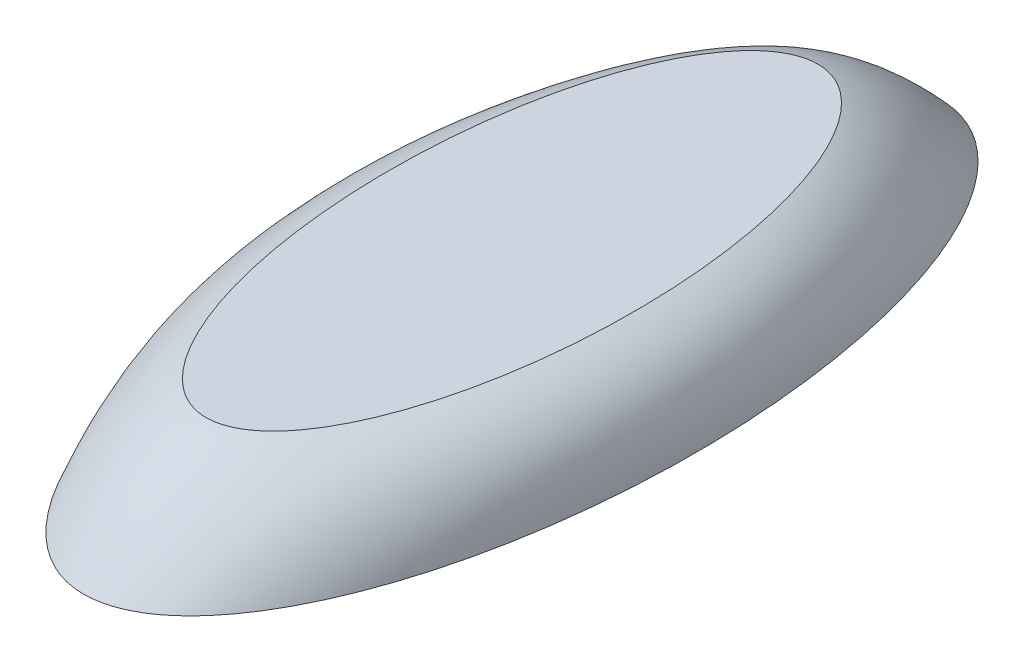
ISO-10303-21;
HEADER;
FILE_DESCRIPTION(('STEP AP214'),'2;1');
FILE_NAME('part.step','',(''),(''),'','','');
FILE_SCHEMA(('AUTOMOTIVE_DESIGN { 1 0 10303 214 1 1 1 1 }'));
ENDSEC;
DATA;
#1=APPLICATION_CONTEXT('core data for automotive mechanical design processes');
#2=APPLICATION_PROTOCOL_DEFINITION('international standard','automotive_design',2000,#1);
#3=PRODUCT_CONTEXT('',#1,'mechanical');
#4=PRODUCT('Part','Part','',(#3));
#5=PRODUCT_RELATED_PRODUCT_CATEGORY('part','',(#4));
#6=PRODUCT_DEFINITION_FORMATION('','',#4);
#7=PRODUCT_DEFINITION_CONTEXT('part definition',#1,'design');
#8=PRODUCT_DEFINITION('design','',#6,#7);
#9=PRODUCT_DEFINITION_SHAPE('','',#8);
#10=(LENGTH_UNIT() NAMED_UNIT(*) SI_UNIT(.MILLI.,.METRE.));
#11=(NAMED_UNIT(*) PLANE_ANGLE_UNIT() SI_UNIT($,.RADIAN.));
#12=(NAMED_UNIT(*) SI_UNIT($,.STERADIAN.) SOLID_ANGLE_UNIT());
#13=UNCERTAINTY_MEASURE_WITH_UNIT(LENGTH_MEASURE(1.E-05),#10,'distance_accuracy_value','');
#14=(GEOMETRIC_REPRESENTATION_CONTEXT(3) GLOBAL_UNCERTAINTY_ASSIGNED_CONTEXT((#13)) GLOBAL_UNIT_ASSIGNED_CONTEXT((#10,
#11,#12)) REPRESENTATION_CONTEXT('',''));
#15=CARTESIAN_POINT('',(0.,0.,0.));
#16=DIRECTION('',(0.,0.,1.));
#17=DIRECTION('',(1.,0.,0.));
#18=AXIS2_PLACEMENT_3D('',#15,#16,#17);
#19=CARTESIAN_POINT('',(0.,0.,0.));
#20=DIRECTION('',(0.,1.,0.));
#21=DIRECTION('',(0.,0.,1.));
#22=AXIS2_PLACEMENT_3D('',#19,#20,#21);
#23=PLANE('',#22);
#24=CARTESIAN_POINT('',(0.,0.,200.));
#25=DIRECTION('',(0.,1.,0.));
#26=DIRECTION('',(0.,0.,1.));
#27=AXIS2_PLACEMENT_3D('',#24,#25,#26);
#28=CIRCLE('',#27,20.);
#29=CARTESIAN_POINT('',(0.,0.,220.));
#30=VERTEX_POINT('',#29);
#31=EDGE_CURVE('E12',#30,#30,#28,.F.);
#32=ORIENTED_EDGE('',*,*,#31,.F.);
#33=EDGE_LOOP('',(#32));
#34=FACE_BOUND('',#33,.T.);
#35=CARTESIAN_POINT('',(0.,0.,0.));
#36=DIRECTION('',(0.,1.,0.));
#37=DIRECTION('',(0.,0.,-1.));
#38=AXIS2_PLACEMENT_3D('',#35,#36,#37);
#39=ELLIPSE('',#38,280.,120.);
#40=CARTESIAN_POINT('',(0.,0.,-280.));
#41=VERTEX_POINT('',#40);
#42=EDGE_CURVE('E95',#41,#41,#39,.T.);
#43=ORIENTED_EDGE('',*,*,#42,.F.);
#44=EDGE_LOOP('',(#43));
#45=FACE_BOUND('',#44,.T.);
#46=ADVANCED_FACE('F88',(#34,#45),#23,.F.);
#47=CARTESIAN_POINT('',(0.,60.,0.));
#48=DIRECTION('',(0.,1.,0.));
#49=DIRECTION('',(0.,0.,1.));
#50=AXIS2_PLACEMENT_3D('',#47,#48,#49);
#51=PLANE('',#50);
#52=CARTESIAN_POINT('',(0.,60.,0.));
#53=DIRECTION('',(0.,1.,0.));
#54=DIRECTION('',(0.,0.,-1.));
#55=AXIS2_PLACEMENT_3D('',#52,#53,#54);
#56=ELLIPSE('',#55,200.,80.);
#57=CARTESIAN_POINT('',(0.,60.,-200.));
#58=VERTEX_POINT('',#57);
#59=EDGE_CURVE('E99',#58,#58,#56,.T.);
#60=ORIENTED_EDGE('',*,*,#59,.T.);
#61=EDGE_LOOP('',(#60));
#62=FACE_BOUND('',#61,.T.);
#63=ADVANCED_FACE('F126',(#62),#51,.T.);
#64=CARTESIAN_POINT('',(-80.,60.,0.));
#65=CARTESIAN_POINT('',(-108.447875960043,49.7780585705095,0.));
#66=CARTESIAN_POINT('',(-121.781209293377,29.7780585705095,0.));
#67=CARTESIAN_POINT('',(-120.,0.,0.));
#68=CARTESIAN_POINT('',(-80.,60.,-4.79439846810019));
#69=CARTESIAN_POINT('',(-108.447875960043,49.7780585705094,-5.46610361813864));
#70=CARTESIAN_POINT('',(-121.781209293377,29.7780585705094,-6.1378087681771));
#71=CARTESIAN_POINT('',(-120.,0.,-6.80951391821557));
#72=CARTESIAN_POINT('',(-79.8622091233469,59.9999999999998,-14.383191907363));
#73=CARTESIAN_POINT('',(-108.226065448784,49.7780585705094,-16.3983058795767));
#74=CARTESIAN_POINT('',(-121.534420329647,29.7780585705094,-18.4134198517905));
#75=CARTESIAN_POINT('',(-119.787273765936,0.,-20.4285338240043));
#76=CARTESIAN_POINT('',(-79.2396950386325,60.0000000000002,-28.7544315753707));
#77=CARTESIAN_POINT('',(-107.236099948443,49.7780585705096,-32.7819580703852));
#78=CARTESIAN_POINT('',(-120.431618511639,29.7780585705095,-36.8094845653997));
#79=CARTESIAN_POINT('',(-118.82625072822,0.,-40.8370110604142));
#80=CARTESIAN_POINT('',(-78.1935862540376,59.9999999999997,-43.1011336574572));
#81=CARTESIAN_POINT('',(-105.590834667763,49.7780585705093,-49.1355334950695));
#82=CARTESIAN_POINT('',(-118.596794935939,29.7780585705094,-55.1699333326817));
#83=CARTESIAN_POINT('',(-117.211467058565,0.,-61.204333170294));
#84=CARTESIAN_POINT('',(-76.7105353068594,60.0000000000003,-57.4094133334357));
#85=CARTESIAN_POINT('',(-103.285659417491,49.7780585705097,-65.4419982177873));
#86=CARTESIAN_POINT('',(-116.023006465094,29.7780585705096,-73.4745831021388));
#87=CARTESIAN_POINT('',(-114.92257644967,0.,-81.5071679864904));
#88=CARTESIAN_POINT('',(-74.7706592610285,59.9999999999997,-71.663139379065));
#89=CARTESIAN_POINT('',(-100.308326977207,49.7780585705093,-81.6816080373639));
#90=CARTESIAN_POINT('',(-112.694571372685,29.7780585705094,-91.7000766956629));
#91=CARTESIAN_POINT('',(-111.92939244746,0.,-101.718545353962));
#92=CARTESIAN_POINT('',(-72.3463299086695,60.0000000000003,-85.8428288095825));
#93=CARTESIAN_POINT('',(-96.6374998112937,49.7780585705096,-97.8304560395251));
#94=CARTESIAN_POINT('',(-108.585372573697,29.7780585705095,-109.818083269468));
#95=CARTESIAN_POINT('',(-108.189948195879,0.,-121.80571049941));
#96=CARTESIAN_POINT('',(-69.4000185494256,59.9999999999998,-99.9237338910966));
#97=CARTESIAN_POINT('',(-92.2403753757505,49.7780585705093,-113.858330061785));
#98=CARTESIAN_POINT('',(-103.656263458839,29.7780585705094,-127.792926232473));
#99=CARTESIAN_POINT('',(-103.647682798693,0.,-141.72752240316));
#100=CARTESIAN_POINT('',(-65.8814919504899,60.0000000000002,-113.873408990024));
#101=CARTESIAN_POINT('',(-87.0692772528317,49.7780585705096,-129.725410102575));
#102=CARTESIAN_POINT('',(-97.8510542037765,29.7780585705095,-145.577411215127));
#103=CARTESIAN_POINT('',(-98.2268228033242,0.,-161.429412327678));
#104=CARTESIAN_POINT('',(-61.7227193103504,59.9999999999998,-127.646739390378));
#105=CARTESIAN_POINT('',(-81.0562499551465,49.7780585705094,-145.376910045367));
#106=CARTESIAN_POINT('',(-91.0907944135878,29.7780585705094,-163.107080700355));
#107=CARTESIAN_POINT('',(-91.8263526856743,0.,-180.837251355343));
#108=CARTESIAN_POINT('',(-57.6466731823902,60.,-138.923890637143));
#109=CARTESIAN_POINT('',(-75.2636647441262,49.7780585705095,-158.174379143041));
#110=CARTESIAN_POINT('',(-84.5687648833367,29.7780585705095,-177.42486764894));
#111=CARTESIAN_POINT('',(-85.5619736000217,0.,-196.675356154839));
#112=CARTESIAN_POINT('',(-53.9546352661396,60.,-147.775161733688));
#113=CARTESIAN_POINT('',(-70.0916837669534,49.7780585705095,-168.204963767924));
#114=CARTESIAN_POINT('',(-78.7397273212565,29.7780585705095,-188.63476580216));
#115=CARTESIAN_POINT('',(-79.8987659290488,0.,-209.064567836396));
#116=CARTESIAN_POINT('',(-50.9477770612434,60.,-154.309323406345));
#117=CARTESIAN_POINT('',(-65.9193645522755,49.7780585705095,-175.600523841074));
#118=CARTESIAN_POINT('',(-74.0343335085773,29.7780585705095,-196.891724275803));
#119=CARTESIAN_POINT('',(-75.2926839301487,0.,-218.182924710531));
#120=CARTESIAN_POINT('',(-47.6784412346461,60.,-160.716761705135));
#121=CARTESIAN_POINT('',(-61.4277223826953,49.7780585705095,-182.842779099962));
#122=CARTESIAN_POINT('',(-68.9666091848576,29.7780585705095,-204.96879649479));
#123=CARTESIAN_POINT('',(-70.2951016411329,0.,-227.094813889618));
#124=CARTESIAN_POINT('',(-44.1156211802511,60.,-166.96631379679));
#125=CARTESIAN_POINT('',(-56.5827056756738,49.7780585705095,-189.89352114543));
#126=CARTESIAN_POINT('',(-63.4980740134096,29.7780585705095,-212.820728494069));
#127=CARTESIAN_POINT('',(-64.8617261934586,0.,-235.747935842709));
#128=CARTESIAN_POINT('',(-40.2223900320118,59.9999999999999,-173.016536216889));
#129=CARTESIAN_POINT('',(-51.3450506510515,49.7780585705094,-196.704249762778));
#130=CARTESIAN_POINT('',(-57.5857435222549,29.7780585705095,-220.391963308667));
#131=CARTESIAN_POINT('',(-58.944468645622,0.,-244.079676854556));
#132=CARTESIAN_POINT('',(-35.9539486617542,60.0000000000001,-178.80967777014));
#133=CARTESIAN_POINT('',(-45.6669005845575,49.7780585705095,-203.206694130495));
#134=CARTESIAN_POINT('',(-51.1773196133192,29.7780585705095,-227.60371049085));
#135=CARTESIAN_POINT('',(-52.4852057480393,0.,-252.000726851205));
#136=CARTESIAN_POINT('',(-31.2574369631969,60.,-184.264167008154));
#137=CARTESIAN_POINT('',(-39.4932439894937,49.7780585705095,-209.30639228539));
#138=CARTESIAN_POINT('',(-44.2142556417813,29.7780585705095,-234.348617562627));
#139=CARTESIAN_POINT('',(-45.4204719200599,0.,-259.390842839864));
#140=CARTESIAN_POINT('',(-26.0734092976348,60.0000000000001,-189.262274083501));
#141=CARTESIAN_POINT('',(-32.7640489069881,49.7780585705096,-214.868898279164));
#142=CARTESIAN_POINT('',(-36.6345495508963,29.7780585705095,-240.475522474828));
#143=CARTESIAN_POINT('',(-37.6849112293595,0.,-266.082146670492));
#144=CARTESIAN_POINT('',(-20.3438832323252,59.9999999999999,-193.633264705752));
#145=CARTESIAN_POINT('',(-25.4247665692805,49.7780585705094,-219.703762749934));
#146=CARTESIAN_POINT('',(-28.3857024601799,29.7780585705095,-245.774260794117));
#147=CARTESIAN_POINT('',(-29.2266909050235,0.,-271.844758838299));
#148=CARTESIAN_POINT('',(-14.0354932575096,60.0000000000001,-197.134799500855));
#149=CARTESIAN_POINT('',(-17.4521672709154,49.7780585705096,-223.548316105621));
#150=CARTESIAN_POINT('',(-19.4532366907734,29.7780585705095,-249.961832710387));
#151=CARTESIAN_POINT('',(-20.0387015170838,0.,-276.375349315152));
#152=CARTESIAN_POINT('',(-7.19063065364496,59.9999999999999,-199.45339384976));
#153=CARTESIAN_POINT('',(-8.90674713424706,49.7780585705094,-226.074354702159));
#154=CARTESIAN_POINT('',(-9.91436942922216,29.7780585705095,-252.695315554559));
#155=CARTESIAN_POINT('',(-10.2134975385703,0.,-279.316276406958));
#156=CARTESIAN_POINT('',(0.,60.0000000000001,-200.274057213205));
#157=CARTESIAN_POINT('',(0.,49.7780585705096,-226.963555006688));
#158=CARTESIAN_POINT('',(0.,29.7780585705095,-253.653052800172));
#159=CARTESIAN_POINT('',(-1.66533453693773E-13,0.,-280.342550593655));
#160=CARTESIAN_POINT('',(7.19063065364482,59.9999999999998,-199.453393849759));
#161=CARTESIAN_POINT('',(8.90674713424692,49.7780585705094,-226.074354702159));
#162=CARTESIAN_POINT('',(9.91436942922194,29.7780585705094,-252.695315554558));
#163=CARTESIAN_POINT('',(10.2134975385699,0.,-279.316276406958));
#164=CARTESIAN_POINT('',(14.0354932575095,60.0000000000002,-197.134799500855));
#165=CARTESIAN_POINT('',(17.4521672709154,49.7780585705096,-223.548316105621));
#166=CARTESIAN_POINT('',(19.4532366907734,29.7780585705096,-249.961832710387));
#167=CARTESIAN_POINT('',(20.0387015170837,0.,-276.375349315153));
#168=CARTESIAN_POINT('',(20.3438832323249,59.9999999999998,-193.633264705752));
#169=CARTESIAN_POINT('',(25.4247665692803,49.7780585705094,-219.703762749934));
#170=CARTESIAN_POINT('',(28.3857024601798,29.7780585705094,-245.774260794116));
#171=CARTESIAN_POINT('',(29.2266909050234,0.,-271.844758838299));
#172=CARTESIAN_POINT('',(26.0734092976347,60.0000000000002,-189.262274083501));
#173=CARTESIAN_POINT('',(32.764048906988,49.7780585705096,-214.868898279165));
#174=CARTESIAN_POINT('',(36.6345495508962,29.7780585705096,-240.475522474829));
#175=CARTESIAN_POINT('',(37.6849112293593,0.,-266.082146670492));
#176=CARTESIAN_POINT('',(31.2574369631968,59.9999999999998,-184.264167008154));
#177=CARTESIAN_POINT('',(39.4932439894936,49.7780585705094,-209.30639228539));
#178=CARTESIAN_POINT('',(44.2142556417813,29.7780585705094,-234.348617562626));
#179=CARTESIAN_POINT('',(45.4204719200598,0.,-259.390842839862));
#180=CARTESIAN_POINT('',(35.953948661754,60.0000000000001,-178.809677770141));
#181=CARTESIAN_POINT('',(45.6669005845575,49.7780585705096,-203.206694130496));
#182=CARTESIAN_POINT('',(51.1773196133192,29.7780585705095,-227.603710490851));
#183=CARTESIAN_POINT('',(52.4852057480393,0.,-252.000726851206));
#184=CARTESIAN_POINT('',(40.2223900320119,60.,-173.016536216888));
#185=CARTESIAN_POINT('',(51.3450506510517,49.7780585705095,-196.704249762777));
#186=CARTESIAN_POINT('',(57.5857435222551,29.7780585705095,-220.391963308666));
#187=CARTESIAN_POINT('',(58.9444686456222,0.,-244.079676854555));
#188=CARTESIAN_POINT('',(44.115621180251,60.,-166.96631379679));
#189=CARTESIAN_POINT('',(56.5827056756736,49.7780585705095,-189.89352114543));
#190=CARTESIAN_POINT('',(63.4980740134094,29.7780585705095,-212.820728494069));
#191=CARTESIAN_POINT('',(64.8617261934583,0.,-235.747935842708));
#192=CARTESIAN_POINT('',(47.6784412346463,60.,-160.716761705135));
#193=CARTESIAN_POINT('',(61.4277223826955,49.7780585705095,-182.842779099962));
#194=CARTESIAN_POINT('',(68.9666091848578,29.7780585705095,-204.96879649479));
#195=CARTESIAN_POINT('',(70.295101641133,0.,-227.094813889618));
#196=CARTESIAN_POINT('',(50.9477770612433,60.,-154.309323406345));
#197=CARTESIAN_POINT('',(65.9193645522756,49.7780585705095,-175.600523841074));
#198=CARTESIAN_POINT('',(74.0343335085775,29.7780585705095,-196.891724275802));
#199=CARTESIAN_POINT('',(75.2926839301489,0.,-218.182924710531));
#200=CARTESIAN_POINT('',(53.9546352661395,60.,-147.775161733688));
#201=CARTESIAN_POINT('',(70.0916837669535,49.7780585705095,-168.204963767924));
#202=CARTESIAN_POINT('',(78.7397273212566,29.7780585705095,-188.63476580216));
#203=CARTESIAN_POINT('',(79.8987659290489,0.,-209.064567836396));
#204=CARTESIAN_POINT('',(57.64667318239,60.,-138.923890637143));
#205=CARTESIAN_POINT('',(75.2636647441261,49.7780585705095,-158.174379143041));
#206=CARTESIAN_POINT('',(84.5687648833365,29.7780585705095,-177.42486764894));
#207=CARTESIAN_POINT('',(85.5619736000215,0.,-196.675356154838));
#208=CARTESIAN_POINT('',(61.7227193103504,59.9999999999999,-127.646739390378));
#209=CARTESIAN_POINT('',(81.0562499551467,49.7780585705094,-145.376910045366));
#210=CARTESIAN_POINT('',(91.0907944135881,29.7780585705095,-163.107080700355));
#211=CARTESIAN_POINT('',(91.8263526856746,0.,-180.837251355343));
#212=CARTESIAN_POINT('',(65.8814919504898,60.0000000000002,-113.873408990024));
#213=CARTESIAN_POINT('',(87.0692772528317,49.7780585705096,-129.725410102575));
#214=CARTESIAN_POINT('',(97.8510542037764,29.7780585705096,-145.577411215127));
#215=CARTESIAN_POINT('',(98.2268228033241,0.,-161.429412327678));
#216=CARTESIAN_POINT('',(69.4000185494258,59.9999999999997,-99.9237338910966));
#217=CARTESIAN_POINT('',(92.2403753757507,49.7780585705093,-113.858330061784));
#218=CARTESIAN_POINT('',(103.65626345884,29.7780585705094,-127.792926232472));
#219=CARTESIAN_POINT('',(103.647682798693,0.,-141.72752240316));
#220=CARTESIAN_POINT('',(72.3463299086694,60.0000000000003,-85.8428288095825));
#221=CARTESIAN_POINT('',(96.6374998112937,49.7780585705097,-97.8304560395253));
#222=CARTESIAN_POINT('',(108.585372573697,29.7780585705096,-109.818083269468));
#223=CARTESIAN_POINT('',(108.189948195879,0.,-121.805710499411));
#224=CARTESIAN_POINT('',(74.7706592610285,59.9999999999997,-71.6631393790652));
#225=CARTESIAN_POINT('',(100.308326977208,49.7780585705093,-81.6816080373641));
#226=CARTESIAN_POINT('',(112.694571372685,29.7780585705094,-91.7000766956629));
#227=CARTESIAN_POINT('',(111.92939244746,0.,-101.718545353962));
#228=CARTESIAN_POINT('',(76.7105353068594,60.0000000000003,-57.4094133334357));
#229=CARTESIAN_POINT('',(103.285659417491,49.7780585705097,-65.4419982177873));
#230=CARTESIAN_POINT('',(116.023006465094,29.7780585705096,-73.4745831021388));
#231=CARTESIAN_POINT('',(114.92257644967,0.,-81.5071679864903));
#232=CARTESIAN_POINT('',(78.1935862540377,59.9999999999998,-43.1011336574576));
#233=CARTESIAN_POINT('',(105.590834667763,49.7780585705094,-49.1355334950698));
#234=CARTESIAN_POINT('',(118.596794935939,29.7780585705094,-55.1699333326821));
#235=CARTESIAN_POINT('',(117.211467058565,0.,-61.2043331702943));
#236=CARTESIAN_POINT('',(79.2396950386323,60.0000000000001,-28.7544315753709));
#237=CARTESIAN_POINT('',(107.236099948443,49.7780585705096,-32.7819580703854));
#238=CARTESIAN_POINT('',(120.431618511639,29.7780585705095,-36.8094845653998));
#239=CARTESIAN_POINT('',(118.82625072822,0.,-40.8370110604142));
#240=CARTESIAN_POINT('',(79.862209123347,59.9999999999999,-14.383191907363));
#241=CARTESIAN_POINT('',(108.226065448784,49.7780585705094,-16.3983058795769));
#242=CARTESIAN_POINT('',(121.534420329647,29.7780585705095,-18.4134198517908));
#243=CARTESIAN_POINT('',(119.787273765936,0.,-20.4285338240047));
#244=CARTESIAN_POINT('',(80.,60.,-4.79439846810014));
#245=CARTESIAN_POINT('',(108.447875960043,49.7780585705095,-5.46610361813863));
#246=CARTESIAN_POINT('',(121.781209293377,29.7780585705095,-6.13780876817708));
#247=CARTESIAN_POINT('',(120.,0.,-6.80951391821551));
#248=CARTESIAN_POINT('',(80.,60.,4.79439846810021));
#249=CARTESIAN_POINT('',(108.447875960043,49.7780585705095,5.46610361813863));
#250=CARTESIAN_POINT('',(121.781209293377,29.7780585705095,6.13780876817708));
#251=CARTESIAN_POINT('',(120.,0.,6.80951391821556));
#252=CARTESIAN_POINT('',(79.862209123347,60.,14.3831919073629));
#253=CARTESIAN_POINT('',(108.226065448785,49.7780585705095,16.3983058795767));
#254=CARTESIAN_POINT('',(121.534420329648,29.7780585705095,18.4134198517904));
#255=CARTESIAN_POINT('',(119.787273765936,0.,20.4285338240042));
#256=CARTESIAN_POINT('',(79.2396950386324,60.,28.7544315753707));
#257=CARTESIAN_POINT('',(107.236099948443,49.7780585705095,32.7819580703851));
#258=CARTESIAN_POINT('',(120.431618511639,29.7780585705095,36.8094845653996));
#259=CARTESIAN_POINT('',(118.82625072822,0.,40.837011060414));
#260=CARTESIAN_POINT('',(78.1935862540375,60.,43.1011336574572));
#261=CARTESIAN_POINT('',(105.590834667763,49.7780585705095,49.1355334950694));
#262=CARTESIAN_POINT('',(118.596794935939,29.7780585705095,55.1699333326817));
#263=CARTESIAN_POINT('',(117.211467058566,0.,61.204333170294));
#264=CARTESIAN_POINT('',(76.7105353068595,60.,57.4094133334357));
#265=CARTESIAN_POINT('',(103.285659417491,49.7780585705095,65.4419982177872));
#266=CARTESIAN_POINT('',(116.023006465094,29.7780585705095,73.4745831021386));
#267=CARTESIAN_POINT('',(114.922576449669,0.,81.5071679864901));
#268=CARTESIAN_POINT('',(74.7706592610285,60.,71.6631393790651));
#269=CARTESIAN_POINT('',(100.308326977207,49.7780585705095,81.6816080373641));
#270=CARTESIAN_POINT('',(112.694571372685,29.7780585705095,91.700076695663));
#271=CARTESIAN_POINT('',(111.92939244746,0.,101.718545353962));
#272=CARTESIAN_POINT('',(72.3463299086695,60.,85.8428288095823));
#273=CARTESIAN_POINT('',(96.6374998112938,49.7780585705095,97.830456039525));
#274=CARTESIAN_POINT('',(108.585372573697,29.7780585705095,109.818083269468));
#275=CARTESIAN_POINT('',(108.189948195879,0.,121.80571049941));
#276=CARTESIAN_POINT('',(69.4000185494258,60.0000000000001,99.9237338910966));
#277=CARTESIAN_POINT('',(92.2403753757506,49.7780585705095,113.858330061784));
#278=CARTESIAN_POINT('',(103.656263458839,29.7780585705095,127.792926232472));
#279=CARTESIAN_POINT('',(103.647682798692,0.,141.72752240316));
#280=CARTESIAN_POINT('',(65.8814919504897,59.9999999999999,113.873408990024));
#281=CARTESIAN_POINT('',(87.0692772528316,49.7780585705094,129.725410102575));
#282=CARTESIAN_POINT('',(97.8510542037765,29.7780585705095,145.577411215127));
#283=CARTESIAN_POINT('',(98.2268228033243,0.,161.429412327678));
#284=CARTESIAN_POINT('',(61.7227193103506,60.0000000000001,127.646739390378));
#285=CARTESIAN_POINT('',(81.0562499551467,49.7780585705095,145.376910045366));
#286=CARTESIAN_POINT('',(91.0907944135879,29.7780585705095,163.107080700355));
#287=CARTESIAN_POINT('',(91.8263526856743,0.,180.837251355343));
#288=CARTESIAN_POINT('',(57.64667318239,59.9999999999999,138.923890637143));
#289=CARTESIAN_POINT('',(75.2636647441261,49.7780585705094,158.174379143042));
#290=CARTESIAN_POINT('',(84.5687648833367,29.7780585705095,177.42486764894));
#291=CARTESIAN_POINT('',(85.5619736000218,0.,196.675356154839));
#292=CARTESIAN_POINT('',(53.9546352661397,60.0000000000001,147.775161733687));
#293=CARTESIAN_POINT('',(70.0916837669536,49.7780585705095,168.204963767924));
#294=CARTESIAN_POINT('',(78.7397273212566,29.7780585705095,188.63476580216));
#295=CARTESIAN_POINT('',(79.8987659290489,0.,209.064567836396));
#296=CARTESIAN_POINT('',(50.9477770612433,59.9999999999999,154.309323406346));
#297=CARTESIAN_POINT('',(65.9193645522755,49.7780585705094,175.600523841074));
#298=CARTESIAN_POINT('',(74.0343335085774,29.7780585705095,196.891724275803));
#299=CARTESIAN_POINT('',(75.2926839301488,0.,218.182924710531));
#300=CARTESIAN_POINT('',(47.6784412346464,60.0000000000001,160.716761705134));
#301=CARTESIAN_POINT('',(61.4277223826956,49.7780585705096,182.842779099962));
#302=CARTESIAN_POINT('',(68.9666091848578,29.7780585705095,204.96879649479));
#303=CARTESIAN_POINT('',(70.295101641133,0.,227.094813889617));
#304=CARTESIAN_POINT('',(44.115621180251,59.9999999999999,166.96631379679));
#305=CARTESIAN_POINT('',(56.5827056756738,49.7780585705094,189.89352114543));
#306=CARTESIAN_POINT('',(63.4980740134097,29.7780585705094,212.820728494069));
#307=CARTESIAN_POINT('',(64.8617261934587,0.,235.747935842709));
#308=CARTESIAN_POINT('',(40.2223900320121,60.,173.016536216888));
#309=CARTESIAN_POINT('',(51.3450506510517,49.7780585705095,196.704249762777));
#310=CARTESIAN_POINT('',(57.585743522255,29.7780585705095,220.391963308666));
#311=CARTESIAN_POINT('',(58.944468645622,0.,244.079676854555));
#312=CARTESIAN_POINT('',(35.9539486617542,60.,178.80967777014));
#313=CARTESIAN_POINT('',(45.6669005845576,49.7780585705095,203.206694130495));
#314=CARTESIAN_POINT('',(51.1773196133194,29.7780585705095,227.60371049085));
#315=CARTESIAN_POINT('',(52.4852057480395,0.,252.000726851205));
#316=CARTESIAN_POINT('',(31.257436963197,60.0000000000001,184.264167008153));
#317=CARTESIAN_POINT('',(39.4932439894937,49.7780585705095,209.30639228539));
#318=CARTESIAN_POINT('',(44.2142556417813,29.7780585705095,234.348617562627));
#319=CARTESIAN_POINT('',(45.4204719200598,0.,259.390842839863));
#320=CARTESIAN_POINT('',(26.073409297635,60.,189.262274083501));
#321=CARTESIAN_POINT('',(32.7640489069883,49.7780585705095,214.868898279164));
#322=CARTESIAN_POINT('',(36.6345495508964,29.7780585705095,240.475522474828));
#323=CARTESIAN_POINT('',(37.6849112293595,0.,266.082146670491));
#324=CARTESIAN_POINT('',(20.3438832323251,60.,193.633264705751));
#325=CARTESIAN_POINT('',(25.4247665692805,49.7780585705095,219.703762749934));
#326=CARTESIAN_POINT('',(28.38570246018,29.7780585705095,245.774260794117));
#327=CARTESIAN_POINT('',(29.2266909050236,0.,271.8447588383));
#328=CARTESIAN_POINT('',(14.0354932575097,60.,197.134799500856));
#329=CARTESIAN_POINT('',(17.4521672709155,49.7780585705095,223.548316105621));
#330=CARTESIAN_POINT('',(19.4532366907735,29.7780585705095,249.961832710387));
#331=CARTESIAN_POINT('',(20.0387015170838,0.,276.375349315152));
#332=CARTESIAN_POINT('',(7.19063065364505,60.0000000000001,199.453393849759));
#333=CARTESIAN_POINT('',(8.90674713424709,49.7780585705096,226.074354702159));
#334=CARTESIAN_POINT('',(9.91436942922209,29.7780585705095,252.695315554558));
#335=CARTESIAN_POINT('',(10.2134975385701,0.,279.316276406958));
#336=CARTESIAN_POINT('',(0.,60.,200.274057213205));
#337=CARTESIAN_POINT('',(0.,49.7780585705095,226.963555006689));
#338=CARTESIAN_POINT('',(0.,29.7780585705095,253.653052800172));
#339=CARTESIAN_POINT('',(0.,0.,280.342550593655));
#340=CARTESIAN_POINT('',(-7.19063065364473,59.9999999999999,199.45339384976));
#341=CARTESIAN_POINT('',(-8.90674713424685,49.7780585705094,226.074354702159));
#342=CARTESIAN_POINT('',(-9.91436942922192,29.7780585705094,252.695315554558));
#343=CARTESIAN_POINT('',(-10.21349753857,0.,279.316276406958));
#344=CARTESIAN_POINT('',(-14.0354932575094,60.0000000000001,197.134799500855));
#345=CARTESIAN_POINT('',(-17.4521672709153,49.7780585705096,223.548316105621));
#346=CARTESIAN_POINT('',(-19.4532366907734,29.7780585705095,249.961832710387));
#347=CARTESIAN_POINT('',(-20.0387015170837,0.,276.375349315153));
#348=CARTESIAN_POINT('',(-20.3438832323248,59.9999999999999,193.633264705752));
#349=CARTESIAN_POINT('',(-25.4247665692803,49.7780585705094,219.703762749934));
#350=CARTESIAN_POINT('',(-28.3857024601798,29.7780585705095,245.774260794116));
#351=CARTESIAN_POINT('',(-29.2266909050235,0.,271.844758838298));
#352=CARTESIAN_POINT('',(-26.0734092976346,60.0000000000002,189.262274083501));
#353=CARTESIAN_POINT('',(-32.764048906988,49.7780585705096,214.868898279165));
#354=CARTESIAN_POINT('',(-36.6345495508962,29.7780585705095,240.475522474829));
#355=CARTESIAN_POINT('',(-37.6849112293593,0.,266.082146670493));
#356=CARTESIAN_POINT('',(-31.2574369631967,59.9999999999998,184.264167008154));
#357=CARTESIAN_POINT('',(-39.4932439894936,49.7780585705094,209.30639228539));
#358=CARTESIAN_POINT('',(-44.2142556417814,29.7780585705094,234.348617562626));
#359=CARTESIAN_POINT('',(-45.42047192006,0.,259.390842839862));
#360=CARTESIAN_POINT('',(-35.9539486617541,60.0000000000002,178.80967777014));
#361=CARTESIAN_POINT('',(-45.6669005845574,49.7780585705096,203.206694130496));
#362=CARTESIAN_POINT('',(-51.1773196133191,29.7780585705095,227.603710490851));
#363=CARTESIAN_POINT('',(-52.4852057480393,0.,252.000726851206));
#364=CARTESIAN_POINT('',(-40.2223900320118,59.9999999999998,173.016536216889));
#365=CARTESIAN_POINT('',(-51.3450506510516,49.7780585705093,196.704249762777));
#366=CARTESIAN_POINT('',(-57.585743522255,29.7780585705094,220.391963308666));
#367=CARTESIAN_POINT('',(-58.9444686456222,0.,244.079676854555));
#368=CARTESIAN_POINT('',(-44.1156211802511,60.0000000000003,166.96631379679));
#369=CARTESIAN_POINT('',(-56.5827056756738,49.7780585705097,189.89352114543));
#370=CARTESIAN_POINT('',(-63.4980740134096,29.7780585705096,212.820728494069));
#371=CARTESIAN_POINT('',(-64.8617261934585,0.,235.747935842708));
#372=CARTESIAN_POINT('',(-47.6784412346462,59.9999999999997,160.716761705135));
#373=CARTESIAN_POINT('',(-61.4277223826954,49.7780585705093,182.842779099962));
#374=CARTESIAN_POINT('',(-68.9666091848577,29.7780585705094,204.96879649479));
#375=CARTESIAN_POINT('',(-70.295101641133,0.,227.094813889618));
#376=CARTESIAN_POINT('',(-50.9477770612432,60.0000000000001,154.309323406345));
#377=CARTESIAN_POINT('',(-65.9193645522755,49.7780585705096,175.600523841074));
#378=CARTESIAN_POINT('',(-74.0343335085774,29.7780585705095,196.891724275802));
#379=CARTESIAN_POINT('',(-75.2926839301489,0.,218.182924710531));
#380=CARTESIAN_POINT('',(-53.9546352661395,60.,147.775161733688));
#381=CARTESIAN_POINT('',(-70.0916837669534,49.7780585705095,168.204963767924));
#382=CARTESIAN_POINT('',(-78.7397273212565,29.7780585705095,188.63476580216));
#383=CARTESIAN_POINT('',(-79.8987659290488,0.,209.064567836396));
#384=CARTESIAN_POINT('',(-57.6466731823901,60.,138.923890637143));
#385=CARTESIAN_POINT('',(-75.263664744126,49.7780585705095,158.174379143041));
#386=CARTESIAN_POINT('',(-84.5687648833365,29.7780585705095,177.42486764894));
#387=CARTESIAN_POINT('',(-85.5619736000214,0.,196.675356154838));
#388=CARTESIAN_POINT('',(-61.7227193103503,60.,127.646739390379));
#389=CARTESIAN_POINT('',(-81.0562499551467,49.7780585705095,145.376910045367));
#390=CARTESIAN_POINT('',(-91.0907944135881,29.7780585705095,163.107080700355));
#391=CARTESIAN_POINT('',(-91.8263526856747,0.,180.837251355343));
#392=CARTESIAN_POINT('',(-65.8814919504899,60.,113.873408990024));
#393=CARTESIAN_POINT('',(-87.0692772528316,49.7780585705094,129.725410102575));
#394=CARTESIAN_POINT('',(-97.8510542037763,29.7780585705095,145.577411215126));
#395=CARTESIAN_POINT('',(-98.2268228033238,0.,161.429412327678));
#396=CARTESIAN_POINT('',(-69.4000185494258,60.,99.9237338910967));
#397=CARTESIAN_POINT('',(-92.2403753757507,49.7780585705095,113.858330061785));
#398=CARTESIAN_POINT('',(-103.65626345884,29.7780585705095,127.792926232473));
#399=CARTESIAN_POINT('',(-103.647682798693,0.,141.727522403161));
#400=CARTESIAN_POINT('',(-72.3463299086695,60.0000000000001,85.8428288095822));
#401=CARTESIAN_POINT('',(-96.6374998112938,49.7780585705095,97.8304560395251));
#402=CARTESIAN_POINT('',(-108.585372573697,29.7780585705095,109.818083269468));
#403=CARTESIAN_POINT('',(-108.189948195879,0.,121.805710499411));
#404=CARTESIAN_POINT('',(-74.7706592610283,59.9999999999999,71.6631393790653));
#405=CARTESIAN_POINT('',(-100.308326977207,49.7780585705094,81.6816080373642));
#406=CARTESIAN_POINT('',(-112.694571372684,29.7780585705095,91.7000766956632));
#407=CARTESIAN_POINT('',(-111.929392447459,0.,101.718545353962));
#408=CARTESIAN_POINT('',(-76.7105353068595,60.0000000000001,57.4094133334355));
#409=CARTESIAN_POINT('',(-103.285659417491,49.7780585705095,65.4419982177872));
#410=CARTESIAN_POINT('',(-116.023006465094,29.7780585705095,73.4745831021388));
#411=CARTESIAN_POINT('',(-114.92257644967,0.,81.5071679864905));
#412=CARTESIAN_POINT('',(-78.1935862540376,60.,43.1011336574576));
#413=CARTESIAN_POINT('',(-105.590834667763,49.7780585705095,49.1355334950699));
#414=CARTESIAN_POINT('',(-118.596794935938,29.7780585705095,55.1699333326821));
#415=CARTESIAN_POINT('',(-117.211467058565,0.,61.2043331702944));
#416=CARTESIAN_POINT('',(-79.2396950386322,60.,28.7544315753708));
#417=CARTESIAN_POINT('',(-107.236099948443,49.7780585705095,32.7819580703853));
#418=CARTESIAN_POINT('',(-120.431618511639,29.7780585705095,36.8094845653998));
#419=CARTESIAN_POINT('',(-118.82625072822,0.,40.8370110604143));
#420=CARTESIAN_POINT('',(-79.862209123347,60.,14.3831919073629));
#421=CARTESIAN_POINT('',(-108.226065448784,49.7780585705094,16.3983058795769));
#422=CARTESIAN_POINT('',(-121.534420329647,29.7780585705094,18.4134198517908));
#423=CARTESIAN_POINT('',(-119.787273765936,0.,20.4285338240047));
#424=CARTESIAN_POINT('',(-80.,60.,4.79439846810017));
#425=CARTESIAN_POINT('',(-108.447875960043,49.7780585705095,5.46610361813864));
#426=CARTESIAN_POINT('',(-121.781209293377,29.7780585705095,6.1378087681771));
#427=CARTESIAN_POINT('',(-120.,0.,6.80951391821554));
#428=CARTESIAN_POINT('',(-80.,60.,0.));
#429=CARTESIAN_POINT('',(-108.447875960043,49.7780585705095,0.));
#430=CARTESIAN_POINT('',(-121.781209293377,29.7780585705095,0.));
#431=CARTESIAN_POINT('',(-120.,0.,0.));
#432=B_SPLINE_SURFACE_WITH_KNOTS('',3,3,((#64,#65,#66,#67),(#68,#69,#70,#71),(#72,#73,#74,#75),
(#76,#77,#78,#79),(#80,#81,#82,#83),(#84,#85,#86,#87),(#88,#89,#90,#91),(#92,#93,#94,#95),(#96,
#97,#98,#99),(#100,#101,#102,#103),(#104,#105,#106,#107),(#108,#109,#110,#111),(#112,#113,#114,
#115),(#116,#117,#118,#119),(#120,#121,#122,#123),(#124,#125,#126,#127),(#128,#129,#130,#131),
(#132,#133,#134,#135),(#136,#137,#138,#139),(#140,#141,#142,#143),(#144,#145,#146,#147),(#148,
#149,#150,#151),(#152,#153,#154,#155),(#156,#157,#158,#159),(#160,#161,#162,#163),(#164,#165,
#166,#167),(#168,#169,#170,#171),(#172,#173,#174,#175),(#176,#177,#178,#179),(#180,#181,#182,
#183),(#184,#185,#186,#187),(#188,#189,#190,#191),(#192,#193,#194,#195),(#196,#197,#198,#199),
(#200,#201,#202,#203),(#204,#205,#206,#207),(#208,#209,#210,#211),(#212,#213,#214,#215),(#216,
#217,#218,#219),(#220,#221,#222,#223),(#224,#225,#226,#227),(#228,#229,#230,#231),(#232,#233,
#234,#235),(#236,#237,#238,#239),(#240,#241,#242,#243),(#244,#245,#246,#247),(#248,#249,#250,
#251),(#252,#253,#254,#255),(#256,#257,#258,#259),(#260,#261,#262,#263),(#264,#265,#266,#267),
(#268,#269,#270,#271),(#272,#273,#274,#275),(#276,#277,#278,#279),(#280,#281,#282,#283),(#284,
#285,#286,#287),(#288,#289,#290,#291),(#292,#293,#294,#295),(#296,#297,#298,#299),(#300,#301,
#302,#303),(#304,#305,#306,#307),(#308,#309,#310,#311),(#312,#313,#314,#315),(#316,#317,#318,
#319),(#320,#321,#322,#323),(#324,#325,#326,#327),(#328,#329,#330,#331),(#332,#333,#334,#335),
(#336,#337,#338,#339),(#340,#341,#342,#343),(#344,#345,#346,#347),(#348,#349,#350,#351),(#352,
#353,#354,#355),(#356,#357,#358,#359),(#360,#361,#362,#363),(#364,#365,#366,#367),(#368,#369,
#370,#371),(#372,#373,#374,#375),(#376,#377,#378,#379),(#380,#381,#382,#383),(#384,#385,#386,
#387),(#388,#389,#390,#391),(#392,#393,#394,#395),(#396,#397,#398,#399),(#400,#401,#402,#403),
(#404,#405,#406,#407),(#408,#409,#410,#411),(#412,#413,#414,#415),(#416,#417,#418,#419),(#420,
#421,#422,#423),(#424,#425,#426,#427),(#428,#429,#430,#431)),.UNSPECIFIED.,.T.,.F.,.F.,(4,1,1,1,
1,1,1,1,1,1,1,1,1,1,1,1,1,1,1,1,1,1,1,1,1,1,1,1,1,1,1,1,1,1,1,1,1,1,1,1,1,1,1,1,2,1,1,1,1,1,1,1,
1,1,1,1,1,1,1,1,1,1,1,1,1,1,1,1,1,1,1,1,1,1,1,1,1,1,1,1,1,1,1,1,1,1,1,1,4),(4,4),(0.,0.015625,
0.03125,0.046875,0.0625,0.078125,0.09375,0.109375,0.125,0.140625,0.15625,0.1640625,0.171875,
0.1796875,0.1875,0.1953125,0.203125,0.2109375,0.21875,0.2265625,0.234375,0.2421875,0.25,
0.2578125,0.265625,0.2734375,0.28125,0.2890625,0.296875,0.3046875,0.3125,0.3203125,0.328125,
0.3359375,0.34375,0.359375,0.375,0.390625,0.40625,0.421875,0.4375,0.453125,0.46875,0.484375,0.5,
0.515625,0.53125,0.546875,0.5625,0.578125,0.59375,0.609375,0.625,0.640625,0.65625,0.6640625,
0.671875,0.6796875,0.6875,0.6953125,0.703125,0.7109375,0.71875,0.7265625,0.734375,0.7421875,
0.75,0.7578125,0.765625,0.7734375,0.78125,0.7890625,0.796875,0.8046875,0.8125,0.8203125,
0.828125,0.8359375,0.84375,0.859375,0.875,0.890625,0.90625,0.921875,0.9375,0.953125,0.96875,
0.984375,1.),(0.,1.),.UNSPECIFIED.);
#433=ORIENTED_EDGE('',*,*,#59,.F.);
#434=EDGE_LOOP('',(#433));
#435=FACE_BOUND('',#434,.T.);
#436=ORIENTED_EDGE('',*,*,#42,.T.);
#437=EDGE_LOOP('',(#436));
#438=FACE_BOUND('',#437,.T.);
#439=ADVANCED_FACE('F135',(#435,#438),#432,.T.);
#440=CARTESIAN_POINT('',(0.,-5.,200.));
#441=DIRECTION('',(0.,1.,0.));
#442=DIRECTION('',(0.,0.,1.));
#443=AXIS2_PLACEMENT_3D('',#440,#441,#442);
#444=CYLINDRICAL_SURFACE('',#443,20.);
#445=CARTESIAN_POINT('',(0.,-5.,200.));
#446=DIRECTION('',(0.,-1.,0.));
#447=DIRECTION('',(0.,0.,-1.));
#448=AXIS2_PLACEMENT_3D('',#445,#446,#447);
#449=CIRCLE('',#448,20.);
#450=CARTESIAN_POINT('',(0.,-5.,180.));
#451=VERTEX_POINT('',#450);
#452=EDGE_CURVE('E105',#451,#451,#449,.T.);
#453=ORIENTED_EDGE('',*,*,#452,.F.);
#454=EDGE_LOOP('',(#453));
#455=FACE_BOUND('',#454,.T.);
#456=ORIENTED_EDGE('',*,*,#31,.T.);
#457=EDGE_LOOP('',(#456));
#458=FACE_BOUND('',#457,.T.);
#459=ADVANCED_FACE('F137',(#455,#458),#444,.T.);
#460=CARTESIAN_POINT('',(0.,-5.,200.));
#461=DIRECTION('',(0.,-1.,0.));
#462=DIRECTION('',(0.,0.,-1.));
#463=AXIS2_PLACEMENT_3D('',#460,#461,#462);
#464=PLANE('',#463);
#465=ORIENTED_EDGE('',*,*,#452,.T.);
#466=EDGE_LOOP('',(#465));
#467=FACE_BOUND('',#466,.T.);
#468=ADVANCED_FACE('F171',(#467),#464,.T.);
#469=CLOSED_SHELL('',(#46,#63,#439,#459,#468));
#470=MANIFOLD_SOLID_BREP('B2',#469);
#471=ADVANCED_BREP_SHAPE_REPRESENTATION('',(#18,#470),#14);
#472=SHAPE_DEFINITION_REPRESENTATION(#9,#471);
ENDSEC;
END-ISO-10303-21;
